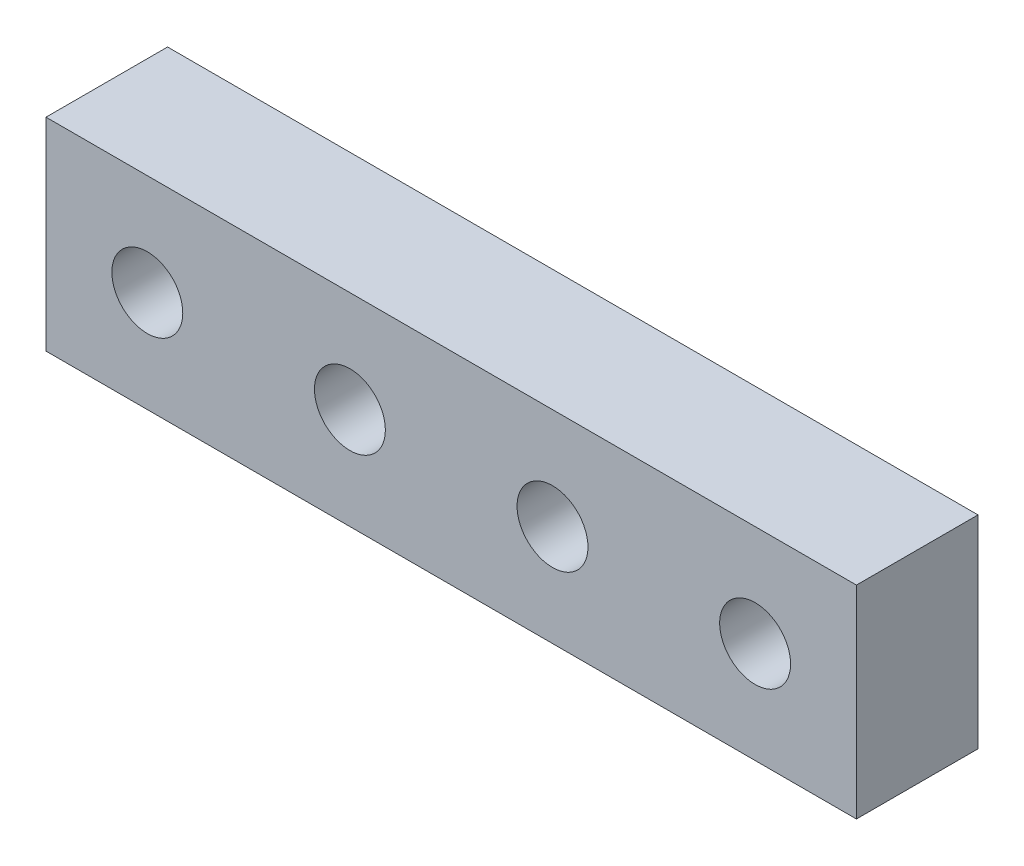
ISO-10303-21;
HEADER;
FILE_DESCRIPTION(('STEP AP214'),'2;1');
FILE_NAME('part.step','',(''),(''),'','','');
FILE_SCHEMA(('AUTOMOTIVE_DESIGN { 1 0 10303 214 1 1 1 1 }'));
ENDSEC;
DATA;
#1=APPLICATION_CONTEXT('core data for automotive mechanical design processes');
#2=APPLICATION_PROTOCOL_DEFINITION('international standard','automotive_design',2000,#1);
#3=PRODUCT_CONTEXT('',#1,'mechanical');
#4=PRODUCT('Part','Part','',(#3));
#5=PRODUCT_RELATED_PRODUCT_CATEGORY('part','',(#4));
#6=PRODUCT_DEFINITION_FORMATION('','',#4);
#7=PRODUCT_DEFINITION_CONTEXT('part definition',#1,'design');
#8=PRODUCT_DEFINITION('design','',#6,#7);
#9=PRODUCT_DEFINITION_SHAPE('','',#8);
#10=(LENGTH_UNIT() NAMED_UNIT(*) SI_UNIT(.MILLI.,.METRE.));
#11=(NAMED_UNIT(*) PLANE_ANGLE_UNIT() SI_UNIT($,.RADIAN.));
#12=(NAMED_UNIT(*) SI_UNIT($,.STERADIAN.) SOLID_ANGLE_UNIT());
#13=UNCERTAINTY_MEASURE_WITH_UNIT(LENGTH_MEASURE(1.E-05),#10,'distance_accuracy_value','');
#14=(GEOMETRIC_REPRESENTATION_CONTEXT(3) GLOBAL_UNCERTAINTY_ASSIGNED_CONTEXT((#13)) GLOBAL_UNIT_ASSIGNED_CONTEXT((#10,
#11,#12)) REPRESENTATION_CONTEXT('',''));
#15=CARTESIAN_POINT('',(0.,0.,0.));
#16=DIRECTION('',(0.,0.,1.));
#17=DIRECTION('',(1.,0.,0.));
#18=AXIS2_PLACEMENT_3D('',#15,#16,#17);
#19=CARTESIAN_POINT('',(0.,0.,6.));
#20=DIRECTION('',(0.,0.,-1.));
#21=DIRECTION('',(-1.,0.,0.));
#22=AXIS2_PLACEMENT_3D('',#19,#20,#21);
#23=PLANE('',#22);
#24=DIRECTION('',(0.,-1.,0.));
#25=VECTOR('',#24,1.);
#26=CARTESIAN_POINT('',(0.,0.,6.));
#27=LINE('',#26,#25);
#28=CARTESIAN_POINT('',(0.,10.,6.));
#29=VERTEX_POINT('',#28);
#30=CARTESIAN_POINT('',(0.,0.,6.));
#31=VERTEX_POINT('',#30);
#32=EDGE_CURVE('E85',#29,#31,#27,.T.);
#33=ORIENTED_EDGE('',*,*,#32,.T.);
#34=DIRECTION('',(1.,0.,0.));
#35=VECTOR('',#34,1.);
#36=CARTESIAN_POINT('',(0.,0.,6.));
#37=LINE('',#36,#35);
#38=CARTESIAN_POINT('',(40.,0.,6.));
#39=VERTEX_POINT('',#38);
#40=EDGE_CURVE('E80',#31,#39,#37,.T.);
#41=ORIENTED_EDGE('',*,*,#40,.T.);
#42=DIRECTION('',(0.,1.,0.));
#43=VECTOR('',#42,1.);
#44=CARTESIAN_POINT('',(40.,0.,6.));
#45=LINE('',#44,#43);
#46=CARTESIAN_POINT('',(40.,10.,6.));
#47=VERTEX_POINT('',#46);
#48=EDGE_CURVE('E83',#39,#47,#45,.T.);
#49=ORIENTED_EDGE('',*,*,#48,.T.);
#50=DIRECTION('',(-1.,0.,0.));
#51=VECTOR('',#50,1.);
#52=CARTESIAN_POINT('',(0.,10.,6.));
#53=LINE('',#52,#51);
#54=EDGE_CURVE('E50',#47,#29,#53,.T.);
#55=ORIENTED_EDGE('',*,*,#54,.T.);
#56=EDGE_LOOP('',(#33,#41,#49,#55));
#57=FACE_BOUND('',#56,.T.);
#58=CARTESIAN_POINT('',(5.,5.,6.));
#59=DIRECTION('',(0.,0.,1.));
#60=DIRECTION('',(1.,0.,0.));
#61=AXIS2_PLACEMENT_3D('',#58,#59,#60);
#62=CIRCLE('',#61,1.75);
#63=CARTESIAN_POINT('',(6.75,5.,6.));
#64=VERTEX_POINT('',#63);
#65=EDGE_CURVE('E100',#64,#64,#62,.T.);
#66=ORIENTED_EDGE('',*,*,#65,.F.);
#67=EDGE_LOOP('',(#66));
#68=FACE_BOUND('',#67,.T.);
#69=CARTESIAN_POINT('',(15.,5.,6.));
#70=DIRECTION('',(0.,0.,1.));
#71=DIRECTION('',(1.,0.,0.));
#72=AXIS2_PLACEMENT_3D('',#69,#70,#71);
#73=CIRCLE('',#72,1.75);
#74=CARTESIAN_POINT('',(16.75,5.,6.));
#75=VERTEX_POINT('',#74);
#76=EDGE_CURVE('E115',#75,#75,#73,.T.);
#77=ORIENTED_EDGE('',*,*,#76,.F.);
#78=EDGE_LOOP('',(#77));
#79=FACE_BOUND('',#78,.T.);
#80=CARTESIAN_POINT('',(25.,5.,6.));
#81=DIRECTION('',(0.,0.,1.));
#82=DIRECTION('',(1.,0.,0.));
#83=AXIS2_PLACEMENT_3D('',#80,#81,#82);
#84=CIRCLE('',#83,1.75);
#85=CARTESIAN_POINT('',(26.75,5.,6.));
#86=VERTEX_POINT('',#85);
#87=EDGE_CURVE('E121',#86,#86,#84,.T.);
#88=ORIENTED_EDGE('',*,*,#87,.F.);
#89=EDGE_LOOP('',(#88));
#90=FACE_BOUND('',#89,.T.);
#91=CARTESIAN_POINT('',(35.,5.,6.));
#92=DIRECTION('',(0.,0.,1.));
#93=DIRECTION('',(1.,0.,0.));
#94=AXIS2_PLACEMENT_3D('',#91,#92,#93);
#95=CIRCLE('',#94,1.75);
#96=CARTESIAN_POINT('',(36.75,5.,6.));
#97=VERTEX_POINT('',#96);
#98=EDGE_CURVE('E127',#97,#97,#95,.T.);
#99=ORIENTED_EDGE('',*,*,#98,.F.);
#100=EDGE_LOOP('',(#99));
#101=FACE_BOUND('',#100,.T.);
#102=ADVANCED_FACE('F33',(#57,#68,#79,#90,#101),#23,.F.);
#103=CARTESIAN_POINT('',(0.,0.,0.));
#104=DIRECTION('',(0.,0.,-1.));
#105=DIRECTION('',(-1.,0.,0.));
#106=AXIS2_PLACEMENT_3D('',#103,#104,#105);
#107=PLANE('',#106);
#108=CARTESIAN_POINT('',(25.,5.,0.));
#109=DIRECTION('',(0.,0.,1.));
#110=DIRECTION('',(1.,0.,0.));
#111=AXIS2_PLACEMENT_3D('',#108,#109,#110);
#112=CIRCLE('',#111,1.75);
#113=CARTESIAN_POINT('',(26.75,5.,0.));
#114=VERTEX_POINT('',#113);
#115=EDGE_CURVE('E124',#114,#114,#112,.T.);
#116=ORIENTED_EDGE('',*,*,#115,.T.);
#117=EDGE_LOOP('',(#116));
#118=FACE_BOUND('',#117,.T.);
#119=CARTESIAN_POINT('',(5.,5.,0.));
#120=DIRECTION('',(0.,0.,1.));
#121=DIRECTION('',(1.,0.,0.));
#122=AXIS2_PLACEMENT_3D('',#119,#120,#121);
#123=CIRCLE('',#122,1.75);
#124=CARTESIAN_POINT('',(6.75,5.,0.));
#125=VERTEX_POINT('',#124);
#126=EDGE_CURVE('E112',#125,#125,#123,.T.);
#127=ORIENTED_EDGE('',*,*,#126,.T.);
#128=EDGE_LOOP('',(#127));
#129=FACE_BOUND('',#128,.T.);
#130=DIRECTION('',(0.,-1.,0.));
#131=VECTOR('',#130,1.);
#132=CARTESIAN_POINT('',(0.,0.,0.));
#133=LINE('',#132,#131);
#134=CARTESIAN_POINT('',(0.,10.,0.));
#135=VERTEX_POINT('',#134);
#136=CARTESIAN_POINT('',(0.,0.,0.));
#137=VERTEX_POINT('',#136);
#138=EDGE_CURVE('E97',#135,#137,#133,.T.);
#139=ORIENTED_EDGE('',*,*,#138,.F.);
#140=DIRECTION('',(-1.,0.,0.));
#141=VECTOR('',#140,1.);
#142=CARTESIAN_POINT('',(0.,10.,0.));
#143=LINE('',#142,#141);
#144=CARTESIAN_POINT('',(40.,10.,0.));
#145=VERTEX_POINT('',#144);
#146=EDGE_CURVE('E73',#145,#135,#143,.T.);
#147=ORIENTED_EDGE('',*,*,#146,.F.);
#148=DIRECTION('',(0.,1.,0.));
#149=VECTOR('',#148,1.);
#150=CARTESIAN_POINT('',(40.,0.,0.));
#151=LINE('',#150,#149);
#152=CARTESIAN_POINT('',(40.,0.,0.));
#153=VERTEX_POINT('',#152);
#154=EDGE_CURVE('E67',#153,#145,#151,.T.);
#155=ORIENTED_EDGE('',*,*,#154,.F.);
#156=DIRECTION('',(1.,0.,0.));
#157=VECTOR('',#156,1.);
#158=CARTESIAN_POINT('',(0.,0.,0.));
#159=LINE('',#158,#157);
#160=EDGE_CURVE('E89',#137,#153,#159,.T.);
#161=ORIENTED_EDGE('',*,*,#160,.F.);
#162=EDGE_LOOP('',(#139,#147,#155,#161));
#163=FACE_BOUND('',#162,.T.);
#164=CARTESIAN_POINT('',(15.,5.,0.));
#165=DIRECTION('',(0.,0.,1.));
#166=DIRECTION('',(1.,0.,0.));
#167=AXIS2_PLACEMENT_3D('',#164,#165,#166);
#168=CIRCLE('',#167,1.75);
#169=CARTESIAN_POINT('',(16.75,5.,0.));
#170=VERTEX_POINT('',#169);
#171=EDGE_CURVE('E118',#170,#170,#168,.T.);
#172=ORIENTED_EDGE('',*,*,#171,.T.);
#173=EDGE_LOOP('',(#172));
#174=FACE_BOUND('',#173,.T.);
#175=CARTESIAN_POINT('',(35.,5.,0.));
#176=DIRECTION('',(0.,0.,1.));
#177=DIRECTION('',(1.,0.,0.));
#178=AXIS2_PLACEMENT_3D('',#175,#176,#177);
#179=CIRCLE('',#178,1.75);
#180=CARTESIAN_POINT('',(36.75,5.,0.));
#181=VERTEX_POINT('',#180);
#182=EDGE_CURVE('E130',#181,#181,#179,.T.);
#183=ORIENTED_EDGE('',*,*,#182,.T.);
#184=EDGE_LOOP('',(#183));
#185=FACE_BOUND('',#184,.T.);
#186=ADVANCED_FACE('F108',(#118,#129,#163,#174,#185),#107,.T.);
#187=CARTESIAN_POINT('',(0.,0.,6.));
#188=DIRECTION('',(1.,0.,0.));
#189=DIRECTION('',(0.,0.,-1.));
#190=AXIS2_PLACEMENT_3D('',#187,#188,#189);
#191=PLANE('',#190);
#192=ORIENTED_EDGE('',*,*,#138,.T.);
#193=DIRECTION('',(0.,0.,-1.));
#194=VECTOR('',#193,1.);
#195=CARTESIAN_POINT('',(0.,0.,6.));
#196=LINE('',#195,#194);
#197=EDGE_CURVE('E11',#31,#137,#196,.T.);
#198=ORIENTED_EDGE('',*,*,#197,.F.);
#199=ORIENTED_EDGE('',*,*,#32,.F.);
#200=DIRECTION('',(0.,0.,-1.));
#201=VECTOR('',#200,1.);
#202=CARTESIAN_POINT('',(0.,10.,6.));
#203=LINE('',#202,#201);
#204=EDGE_CURVE('E93',#29,#135,#203,.T.);
#205=ORIENTED_EDGE('',*,*,#204,.T.);
#206=EDGE_LOOP('',(#192,#198,#199,#205));
#207=FACE_BOUND('',#206,.T.);
#208=ADVANCED_FACE('F35',(#207),#191,.F.);
#209=CARTESIAN_POINT('',(0.,0.,6.));
#210=DIRECTION('',(0.,1.,0.));
#211=DIRECTION('',(0.,0.,1.));
#212=AXIS2_PLACEMENT_3D('',#209,#210,#211);
#213=PLANE('',#212);
#214=ORIENTED_EDGE('',*,*,#160,.T.);
#215=DIRECTION('',(0.,0.,-1.));
#216=VECTOR('',#215,1.);
#217=CARTESIAN_POINT('',(40.,0.,6.));
#218=LINE('',#217,#216);
#219=EDGE_CURVE('E42',#39,#153,#218,.T.);
#220=ORIENTED_EDGE('',*,*,#219,.F.);
#221=ORIENTED_EDGE('',*,*,#40,.F.);
#222=ORIENTED_EDGE('',*,*,#197,.T.);
#223=EDGE_LOOP('',(#214,#220,#221,#222));
#224=FACE_BOUND('',#223,.T.);
#225=ADVANCED_FACE('F88',(#224),#213,.F.);
#226=CARTESIAN_POINT('',(40.,0.,6.));
#227=DIRECTION('',(-1.,0.,0.));
#228=DIRECTION('',(0.,0.,1.));
#229=AXIS2_PLACEMENT_3D('',#226,#227,#228);
#230=PLANE('',#229);
#231=ORIENTED_EDGE('',*,*,#154,.T.);
#232=DIRECTION('',(0.,0.,-1.));
#233=VECTOR('',#232,1.);
#234=CARTESIAN_POINT('',(40.,10.,6.));
#235=LINE('',#234,#233);
#236=EDGE_CURVE('E90',#47,#145,#235,.T.);
#237=ORIENTED_EDGE('',*,*,#236,.F.);
#238=ORIENTED_EDGE('',*,*,#48,.F.);
#239=ORIENTED_EDGE('',*,*,#219,.T.);
#240=EDGE_LOOP('',(#231,#237,#238,#239));
#241=FACE_BOUND('',#240,.T.);
#242=ADVANCED_FACE('F91',(#241),#230,.F.);
#243=CARTESIAN_POINT('',(0.,10.,6.));
#244=DIRECTION('',(0.,-1.,0.));
#245=DIRECTION('',(0.,0.,-1.));
#246=AXIS2_PLACEMENT_3D('',#243,#244,#245);
#247=PLANE('',#246);
#248=ORIENTED_EDGE('',*,*,#146,.T.);
#249=ORIENTED_EDGE('',*,*,#204,.F.);
#250=ORIENTED_EDGE('',*,*,#54,.F.);
#251=ORIENTED_EDGE('',*,*,#236,.T.);
#252=EDGE_LOOP('',(#248,#249,#250,#251));
#253=FACE_BOUND('',#252,.T.);
#254=ADVANCED_FACE('F105',(#253),#247,.F.);
#255=CARTESIAN_POINT('',(5.,5.,6.));
#256=DIRECTION('',(0.,0.,-1.));
#257=DIRECTION('',(-1.,0.,0.));
#258=AXIS2_PLACEMENT_3D('',#255,#256,#257);
#259=CYLINDRICAL_SURFACE('',#258,1.75);
#260=ORIENTED_EDGE('',*,*,#65,.T.);
#261=EDGE_LOOP('',(#260));
#262=FACE_BOUND('',#261,.T.);
#263=ORIENTED_EDGE('',*,*,#126,.F.);
#264=EDGE_LOOP('',(#263));
#265=FACE_BOUND('',#264,.T.);
#266=ADVANCED_FACE('F147',(#262,#265),#259,.F.);
#267=CARTESIAN_POINT('',(15.,5.,6.));
#268=DIRECTION('',(0.,0.,-1.));
#269=DIRECTION('',(-1.,0.,0.));
#270=AXIS2_PLACEMENT_3D('',#267,#268,#269);
#271=CYLINDRICAL_SURFACE('',#270,1.75);
#272=ORIENTED_EDGE('',*,*,#76,.T.);
#273=EDGE_LOOP('',(#272));
#274=FACE_BOUND('',#273,.T.);
#275=ORIENTED_EDGE('',*,*,#171,.F.);
#276=EDGE_LOOP('',(#275));
#277=FACE_BOUND('',#276,.T.);
#278=ADVANCED_FACE('F193',(#274,#277),#271,.F.);
#279=CARTESIAN_POINT('',(25.,5.,6.));
#280=DIRECTION('',(0.,0.,-1.));
#281=DIRECTION('',(-1.,0.,0.));
#282=AXIS2_PLACEMENT_3D('',#279,#280,#281);
#283=CYLINDRICAL_SURFACE('',#282,1.75);
#284=ORIENTED_EDGE('',*,*,#87,.T.);
#285=EDGE_LOOP('',(#284));
#286=FACE_BOUND('',#285,.T.);
#287=ORIENTED_EDGE('',*,*,#115,.F.);
#288=EDGE_LOOP('',(#287));
#289=FACE_BOUND('',#288,.T.);
#290=ADVANCED_FACE('F201',(#286,#289),#283,.F.);
#291=CARTESIAN_POINT('',(35.,5.,6.));
#292=DIRECTION('',(0.,0.,-1.));
#293=DIRECTION('',(-1.,0.,0.));
#294=AXIS2_PLACEMENT_3D('',#291,#292,#293);
#295=CYLINDRICAL_SURFACE('',#294,1.75);
#296=ORIENTED_EDGE('',*,*,#98,.T.);
#297=EDGE_LOOP('',(#296));
#298=FACE_BOUND('',#297,.T.);
#299=ORIENTED_EDGE('',*,*,#182,.F.);
#300=EDGE_LOOP('',(#299));
#301=FACE_BOUND('',#300,.T.);
#302=ADVANCED_FACE('F136',(#298,#301),#295,.F.);
#303=CLOSED_SHELL('',(#102,#186,#208,#225,#242,#254,#266,#278,#290,#302));
#304=MANIFOLD_SOLID_BREP('B2',#303);
#305=ADVANCED_BREP_SHAPE_REPRESENTATION('',(#18,#304),#14);
#306=SHAPE_DEFINITION_REPRESENTATION(#9,#305);
ENDSEC;
END-ISO-10303-21;
